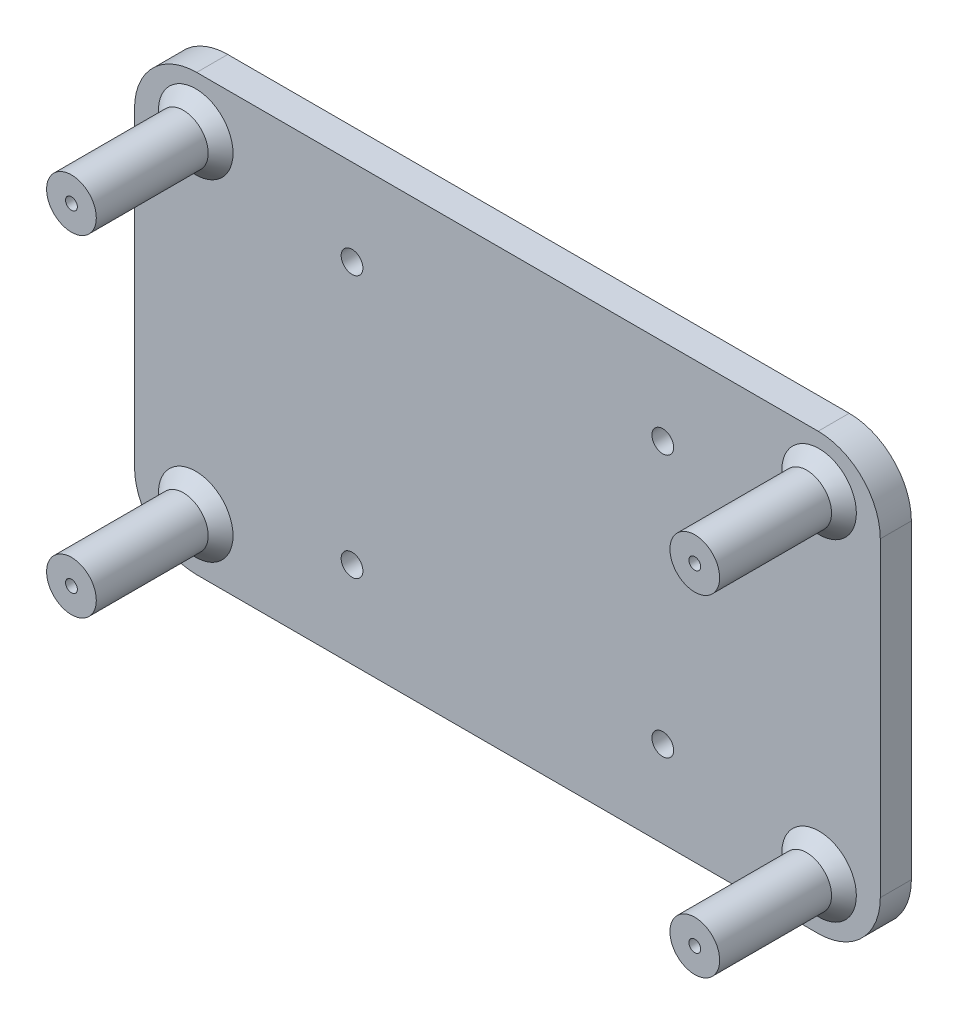
ISO-10303-21;
HEADER;
FILE_DESCRIPTION(('STEP AP214'),'2;1');
FILE_NAME('part.step','',(''),(''),'','','');
FILE_SCHEMA(('AUTOMOTIVE_DESIGN { 1 0 10303 214 1 1 1 1 }'));
ENDSEC;
DATA;
#1=APPLICATION_CONTEXT('core data for automotive mechanical design processes');
#2=APPLICATION_PROTOCOL_DEFINITION('international standard','automotive_design',2000,#1);
#3=PRODUCT_CONTEXT('',#1,'mechanical');
#4=PRODUCT('Part','Part','',(#3));
#5=PRODUCT_RELATED_PRODUCT_CATEGORY('part','',(#4));
#6=PRODUCT_DEFINITION_FORMATION('','',#4);
#7=PRODUCT_DEFINITION_CONTEXT('part definition',#1,'design');
#8=PRODUCT_DEFINITION('design','',#6,#7);
#9=PRODUCT_DEFINITION_SHAPE('','',#8);
#10=(LENGTH_UNIT() NAMED_UNIT(*) SI_UNIT(.MILLI.,.METRE.));
#11=(NAMED_UNIT(*) PLANE_ANGLE_UNIT() SI_UNIT($,.RADIAN.));
#12=(NAMED_UNIT(*) SI_UNIT($,.STERADIAN.) SOLID_ANGLE_UNIT());
#13=UNCERTAINTY_MEASURE_WITH_UNIT(LENGTH_MEASURE(1.E-05),#10,'distance_accuracy_value','');
#14=(GEOMETRIC_REPRESENTATION_CONTEXT(3) GLOBAL_UNCERTAINTY_ASSIGNED_CONTEXT((#13)) GLOBAL_UNIT_ASSIGNED_CONTEXT((#10,
#11,#12)) REPRESENTATION_CONTEXT('',''));
#15=CARTESIAN_POINT('',(0.,0.,0.));
#16=DIRECTION('',(0.,0.,1.));
#17=DIRECTION('',(1.,0.,0.));
#18=AXIS2_PLACEMENT_3D('',#15,#16,#17);
#19=CARTESIAN_POINT('',(-60.,-35.,5.));
#20=DIRECTION('',(1.,0.,0.));
#21=DIRECTION('',(0.,0.,-1.));
#22=AXIS2_PLACEMENT_3D('',#19,#20,#21);
#23=PLANE('',#22);
#24=DIRECTION('',(0.,-1.,0.));
#25=VECTOR('',#24,1.);
#26=CARTESIAN_POINT('',(-60.,-35.,5.));
#27=LINE('',#26,#25);
#28=CARTESIAN_POINT('',(-60.,25.,5.));
#29=VERTEX_POINT('',#28);
#30=CARTESIAN_POINT('',(-60.,-25.,5.));
#31=VERTEX_POINT('',#30);
#32=EDGE_CURVE('E132',#29,#31,#27,.T.);
#33=ORIENTED_EDGE('',*,*,#32,.F.);
#34=DIRECTION('',(0.,0.,-1.));
#35=VECTOR('',#34,1.);
#36=CARTESIAN_POINT('',(-60.,25.,5.));
#37=LINE('',#36,#35);
#38=CARTESIAN_POINT('',(-60.,25.,0.));
#39=VERTEX_POINT('',#38);
#40=EDGE_CURVE('E11',#29,#39,#37,.T.);
#41=ORIENTED_EDGE('',*,*,#40,.T.);
#42=DIRECTION('',(0.,-1.,0.));
#43=VECTOR('',#42,1.);
#44=CARTESIAN_POINT('',(-60.,-35.,0.));
#45=LINE('',#44,#43);
#46=CARTESIAN_POINT('',(-60.,-25.,0.));
#47=VERTEX_POINT('',#46);
#48=EDGE_CURVE('E134',#39,#47,#45,.T.);
#49=ORIENTED_EDGE('',*,*,#48,.T.);
#50=DIRECTION('',(0.,0.,-1.));
#51=VECTOR('',#50,1.);
#52=CARTESIAN_POINT('',(-60.,-25.,5.));
#53=LINE('',#52,#51);
#54=EDGE_CURVE('E44',#47,#31,#53,.F.);
#55=ORIENTED_EDGE('',*,*,#54,.T.);
#56=EDGE_LOOP('',(#33,#41,#49,#55));
#57=FACE_BOUND('',#56,.T.);
#58=ADVANCED_FACE('F35',(#57),#23,.F.);
#59=CARTESIAN_POINT('',(60.,-35.,5.));
#60=DIRECTION('',(0.,1.,0.));
#61=DIRECTION('',(-1.,0.,0.));
#62=AXIS2_PLACEMENT_3D('',#59,#60,#61);
#63=PLANE('',#62);
#64=DIRECTION('',(1.,0.,0.));
#65=VECTOR('',#64,1.);
#66=CARTESIAN_POINT('',(60.,-35.,0.));
#67=LINE('',#66,#65);
#68=CARTESIAN_POINT('',(-50.,-35.,0.));
#69=VERTEX_POINT('',#68);
#70=CARTESIAN_POINT('',(50.,-35.,0.));
#71=VERTEX_POINT('',#70);
#72=EDGE_CURVE('E130',#69,#71,#67,.T.);
#73=ORIENTED_EDGE('',*,*,#72,.T.);
#74=DIRECTION('',(0.,0.,-1.));
#75=VECTOR('',#74,1.);
#76=CARTESIAN_POINT('',(50.,-35.,5.));
#77=LINE('',#76,#75);
#78=CARTESIAN_POINT('',(50.,-35.,5.));
#79=VERTEX_POINT('',#78);
#80=EDGE_CURVE('E109',#71,#79,#77,.F.);
#81=ORIENTED_EDGE('',*,*,#80,.T.);
#82=DIRECTION('',(1.,0.,0.));
#83=VECTOR('',#82,1.);
#84=CARTESIAN_POINT('',(60.,-35.,5.));
#85=LINE('',#84,#83);
#86=CARTESIAN_POINT('',(-50.,-35.,5.));
#87=VERTEX_POINT('',#86);
#88=EDGE_CURVE('E228',#87,#79,#85,.T.);
#89=ORIENTED_EDGE('',*,*,#88,.F.);
#90=DIRECTION('',(0.,0.,-1.));
#91=VECTOR('',#90,1.);
#92=CARTESIAN_POINT('',(-50.,-35.,5.));
#93=LINE('',#92,#91);
#94=EDGE_CURVE('E114',#87,#69,#93,.T.);
#95=ORIENTED_EDGE('',*,*,#94,.T.);
#96=EDGE_LOOP('',(#73,#81,#89,#95));
#97=FACE_BOUND('',#96,.T.);
#98=ADVANCED_FACE('F244',(#97),#63,.F.);
#99=CARTESIAN_POINT('',(60.,-35.,5.));
#100=DIRECTION('',(-1.,0.,0.));
#101=DIRECTION('',(0.,0.,1.));
#102=AXIS2_PLACEMENT_3D('',#99,#100,#101);
#103=PLANE('',#102);
#104=DIRECTION('',(0.,1.,0.));
#105=VECTOR('',#104,1.);
#106=CARTESIAN_POINT('',(60.,-35.,5.));
#107=LINE('',#106,#105);
#108=CARTESIAN_POINT('',(60.,-25.,5.));
#109=VERTEX_POINT('',#108);
#110=CARTESIAN_POINT('',(60.,25.,5.));
#111=VERTEX_POINT('',#110);
#112=EDGE_CURVE('E123',#109,#111,#107,.T.);
#113=ORIENTED_EDGE('',*,*,#112,.F.);
#114=DIRECTION('',(0.,0.,-1.));
#115=VECTOR('',#114,1.);
#116=CARTESIAN_POINT('',(60.,-25.,5.));
#117=LINE('',#116,#115);
#118=CARTESIAN_POINT('',(60.,-25.,0.));
#119=VERTEX_POINT('',#118);
#120=EDGE_CURVE('E108',#109,#119,#117,.T.);
#121=ORIENTED_EDGE('',*,*,#120,.T.);
#122=DIRECTION('',(0.,1.,0.));
#123=VECTOR('',#122,1.);
#124=CARTESIAN_POINT('',(60.,-35.,0.));
#125=LINE('',#124,#123);
#126=CARTESIAN_POINT('',(60.,25.,0.));
#127=VERTEX_POINT('',#126);
#128=EDGE_CURVE('E121',#119,#127,#125,.T.);
#129=ORIENTED_EDGE('',*,*,#128,.T.);
#130=DIRECTION('',(0.,0.,-1.));
#131=VECTOR('',#130,1.);
#132=CARTESIAN_POINT('',(60.,25.,5.));
#133=LINE('',#132,#131);
#134=EDGE_CURVE('E125',#127,#111,#133,.F.);
#135=ORIENTED_EDGE('',*,*,#134,.T.);
#136=EDGE_LOOP('',(#113,#121,#129,#135));
#137=FACE_BOUND('',#136,.T.);
#138=ADVANCED_FACE('F120',(#137),#103,.F.);
#139=CARTESIAN_POINT('',(60.,35.,5.));
#140=DIRECTION('',(0.,-1.,0.));
#141=DIRECTION('',(1.,0.,0.));
#142=AXIS2_PLACEMENT_3D('',#139,#140,#141);
#143=PLANE('',#142);
#144=DIRECTION('',(-1.,0.,0.));
#145=VECTOR('',#144,1.);
#146=CARTESIAN_POINT('',(60.,35.,5.));
#147=LINE('',#146,#145);
#148=CARTESIAN_POINT('',(50.,35.,5.));
#149=VERTEX_POINT('',#148);
#150=CARTESIAN_POINT('',(-50.,35.,5.));
#151=VERTEX_POINT('',#150);
#152=EDGE_CURVE('E142',#149,#151,#147,.T.);
#153=ORIENTED_EDGE('',*,*,#152,.F.);
#154=DIRECTION('',(0.,0.,-1.));
#155=VECTOR('',#154,1.);
#156=CARTESIAN_POINT('',(50.,35.,5.));
#157=LINE('',#156,#155);
#158=CARTESIAN_POINT('',(50.,35.,0.));
#159=VERTEX_POINT('',#158);
#160=EDGE_CURVE('E179',#149,#159,#157,.T.);
#161=ORIENTED_EDGE('',*,*,#160,.T.);
#162=DIRECTION('',(-1.,0.,0.));
#163=VECTOR('',#162,1.);
#164=CARTESIAN_POINT('',(60.,35.,0.));
#165=LINE('',#164,#163);
#166=CARTESIAN_POINT('',(-50.,35.,0.));
#167=VERTEX_POINT('',#166);
#168=EDGE_CURVE('E129',#159,#167,#165,.T.);
#169=ORIENTED_EDGE('',*,*,#168,.T.);
#170=DIRECTION('',(0.,0.,-1.));
#171=VECTOR('',#170,1.);
#172=CARTESIAN_POINT('',(-50.,35.,5.));
#173=LINE('',#172,#171);
#174=EDGE_CURVE('E52',#167,#151,#173,.F.);
#175=ORIENTED_EDGE('',*,*,#174,.T.);
#176=EDGE_LOOP('',(#153,#161,#169,#175));
#177=FACE_BOUND('',#176,.T.);
#178=ADVANCED_FACE('F251',(#177),#143,.F.);
#179=CARTESIAN_POINT('',(0.,0.,5.));
#180=DIRECTION('',(0.,0.,1.));
#181=DIRECTION('',(1.,0.,0.));
#182=AXIS2_PLACEMENT_3D('',#179,#180,#181);
#183=PLANE('',#182);
#184=CARTESIAN_POINT('',(-25.,-21.101703565,5.));
#185=DIRECTION('',(0.,0.,1.));
#186=DIRECTION('',(1.,0.,0.));
#187=AXIS2_PLACEMENT_3D('',#184,#185,#186);
#188=CIRCLE('',#187,1.75);
#189=CARTESIAN_POINT('',(-23.25,-21.101703565,5.));
#190=VERTEX_POINT('',#189);
#191=EDGE_CURVE('E403',#190,#190,#188,.T.);
#192=ORIENTED_EDGE('',*,*,#191,.F.);
#193=EDGE_LOOP('',(#192));
#194=FACE_BOUND('',#193,.T.);
#195=CARTESIAN_POINT('',(25.,-21.101703565,5.));
#196=DIRECTION('',(0.,0.,1.));
#197=DIRECTION('',(1.,0.,0.));
#198=AXIS2_PLACEMENT_3D('',#195,#196,#197);
#199=CIRCLE('',#198,1.75);
#200=CARTESIAN_POINT('',(26.75,-21.101703565,5.));
#201=VERTEX_POINT('',#200);
#202=EDGE_CURVE('E398',#201,#201,#199,.T.);
#203=ORIENTED_EDGE('',*,*,#202,.F.);
#204=EDGE_LOOP('',(#203));
#205=FACE_BOUND('',#204,.T.);
#206=CARTESIAN_POINT('',(25.,21.101703565,5.));
#207=DIRECTION('',(0.,0.,1.));
#208=DIRECTION('',(1.,0.,0.));
#209=AXIS2_PLACEMENT_3D('',#206,#207,#208);
#210=CIRCLE('',#209,1.75);
#211=CARTESIAN_POINT('',(26.75,21.101703565,5.));
#212=VERTEX_POINT('',#211);
#213=EDGE_CURVE('E391',#212,#212,#210,.T.);
#214=ORIENTED_EDGE('',*,*,#213,.F.);
#215=EDGE_LOOP('',(#214));
#216=FACE_BOUND('',#215,.T.);
#217=CARTESIAN_POINT('',(-25.,21.101703565,5.));
#218=DIRECTION('',(0.,0.,1.));
#219=DIRECTION('',(1.,0.,0.));
#220=AXIS2_PLACEMENT_3D('',#217,#218,#219);
#221=CIRCLE('',#220,1.75);
#222=CARTESIAN_POINT('',(-23.25,21.101703565,5.));
#223=VERTEX_POINT('',#222);
#224=EDGE_CURVE('E187',#223,#223,#221,.T.);
#225=ORIENTED_EDGE('',*,*,#224,.F.);
#226=EDGE_LOOP('',(#225));
#227=FACE_BOUND('',#226,.T.);
#228=CARTESIAN_POINT('',(50.15,26.65,5.));
#229=DIRECTION('',(0.,0.,1.));
#230=DIRECTION('',(1.,0.,0.));
#231=AXIS2_PLACEMENT_3D('',#228,#229,#230);
#232=CIRCLE('',#231,6.00000000000001);
#233=CARTESIAN_POINT('',(56.15,26.65,5.));
#234=VERTEX_POINT('',#233);
#235=EDGE_CURVE('E151',#234,#234,#232,.F.);
#236=ORIENTED_EDGE('',*,*,#235,.T.);
#237=EDGE_LOOP('',(#236));
#238=FACE_BOUND('',#237,.T.);
#239=CARTESIAN_POINT('',(50.15,-26.65,5.));
#240=DIRECTION('',(0.,0.,1.));
#241=DIRECTION('',(1.,0.,0.));
#242=AXIS2_PLACEMENT_3D('',#239,#240,#241);
#243=CIRCLE('',#242,6.00000000000001);
#244=CARTESIAN_POINT('',(56.15,-26.65,5.));
#245=VERTEX_POINT('',#244);
#246=EDGE_CURVE('E148',#245,#245,#243,.F.);
#247=ORIENTED_EDGE('',*,*,#246,.T.);
#248=EDGE_LOOP('',(#247));
#249=FACE_BOUND('',#248,.T.);
#250=CARTESIAN_POINT('',(-50.15,-26.65,5.));
#251=DIRECTION('',(0.,0.,1.));
#252=DIRECTION('',(1.,0.,0.));
#253=AXIS2_PLACEMENT_3D('',#250,#251,#252);
#254=CIRCLE('',#253,6.00000000000001);
#255=CARTESIAN_POINT('',(-44.15,-26.65,5.));
#256=VERTEX_POINT('',#255);
#257=EDGE_CURVE('E145',#256,#256,#254,.F.);
#258=ORIENTED_EDGE('',*,*,#257,.T.);
#259=EDGE_LOOP('',(#258));
#260=FACE_BOUND('',#259,.T.);
#261=CARTESIAN_POINT('',(-50.15,26.65,5.));
#262=DIRECTION('',(0.,0.,1.));
#263=DIRECTION('',(1.,0.,0.));
#264=AXIS2_PLACEMENT_3D('',#261,#262,#263);
#265=CIRCLE('',#264,6.00000000000001);
#266=CARTESIAN_POINT('',(-44.15,26.65,5.));
#267=VERTEX_POINT('',#266);
#268=EDGE_CURVE('E141',#267,#267,#265,.F.);
#269=ORIENTED_EDGE('',*,*,#268,.T.);
#270=EDGE_LOOP('',(#269));
#271=FACE_BOUND('',#270,.T.);
#272=ORIENTED_EDGE('',*,*,#88,.T.);
#273=CARTESIAN_POINT('',(50.,-25.,5.));
#274=DIRECTION('',(0.,0.,1.));
#275=DIRECTION('',(1.,0.,0.));
#276=AXIS2_PLACEMENT_3D('',#273,#274,#275);
#277=CIRCLE('',#276,10.);
#278=EDGE_CURVE('E176',#79,#109,#277,.T.);
#279=ORIENTED_EDGE('',*,*,#278,.T.);
#280=ORIENTED_EDGE('',*,*,#112,.T.);
#281=CARTESIAN_POINT('',(50.,25.,5.));
#282=DIRECTION('',(0.,0.,1.));
#283=DIRECTION('',(1.,0.,0.));
#284=AXIS2_PLACEMENT_3D('',#281,#282,#283);
#285=CIRCLE('',#284,10.);
#286=EDGE_CURVE('E59',#111,#149,#285,.T.);
#287=ORIENTED_EDGE('',*,*,#286,.T.);
#288=ORIENTED_EDGE('',*,*,#152,.T.);
#289=CARTESIAN_POINT('',(-50.,25.,5.));
#290=DIRECTION('',(0.,0.,1.));
#291=DIRECTION('',(1.,0.,0.));
#292=AXIS2_PLACEMENT_3D('',#289,#290,#291);
#293=CIRCLE('',#292,10.);
#294=EDGE_CURVE('E173',#151,#29,#293,.T.);
#295=ORIENTED_EDGE('',*,*,#294,.T.);
#296=ORIENTED_EDGE('',*,*,#32,.T.);
#297=CARTESIAN_POINT('',(-50.,-25.,5.));
#298=DIRECTION('',(0.,0.,1.));
#299=DIRECTION('',(1.,0.,0.));
#300=AXIS2_PLACEMENT_3D('',#297,#298,#299);
#301=CIRCLE('',#300,10.);
#302=EDGE_CURVE('E171',#31,#87,#301,.T.);
#303=ORIENTED_EDGE('',*,*,#302,.T.);
#304=EDGE_LOOP('',(#272,#279,#280,#287,#288,#295,#296,#303));
#305=FACE_BOUND('',#304,.T.);
#306=ADVANCED_FACE('F242',(#194,#205,#216,#227,#238,#249,#260,#271,#305),#183,.T.);
#307=CARTESIAN_POINT('',(0.,0.,0.));
#308=DIRECTION('',(0.,0.,1.));
#309=DIRECTION('',(1.,0.,0.));
#310=AXIS2_PLACEMENT_3D('',#307,#308,#309);
#311=PLANE('',#310);
#312=CARTESIAN_POINT('',(-25.,-21.101703565,0.));
#313=DIRECTION('',(0.,0.,1.));
#314=DIRECTION('',(1.,0.,0.));
#315=AXIS2_PLACEMENT_3D('',#312,#313,#314);
#316=CIRCLE('',#315,1.75);
#317=CARTESIAN_POINT('',(-23.25,-21.101703565,0.));
#318=VERTEX_POINT('',#317);
#319=EDGE_CURVE('E39',#318,#318,#316,.T.);
#320=ORIENTED_EDGE('',*,*,#319,.T.);
#321=EDGE_LOOP('',(#320));
#322=FACE_BOUND('',#321,.T.);
#323=CARTESIAN_POINT('',(25.,-21.101703565,0.));
#324=DIRECTION('',(0.,0.,1.));
#325=DIRECTION('',(1.,0.,0.));
#326=AXIS2_PLACEMENT_3D('',#323,#324,#325);
#327=CIRCLE('',#326,1.75);
#328=CARTESIAN_POINT('',(26.75,-21.101703565,0.));
#329=VERTEX_POINT('',#328);
#330=EDGE_CURVE('E189',#329,#329,#327,.T.);
#331=ORIENTED_EDGE('',*,*,#330,.T.);
#332=EDGE_LOOP('',(#331));
#333=FACE_BOUND('',#332,.T.);
#334=CARTESIAN_POINT('',(25.,21.101703565,0.));
#335=DIRECTION('',(0.,0.,1.));
#336=DIRECTION('',(1.,0.,0.));
#337=AXIS2_PLACEMENT_3D('',#334,#335,#336);
#338=CIRCLE('',#337,1.75);
#339=CARTESIAN_POINT('',(26.75,21.101703565,0.));
#340=VERTEX_POINT('',#339);
#341=EDGE_CURVE('E186',#340,#340,#338,.T.);
#342=ORIENTED_EDGE('',*,*,#341,.T.);
#343=EDGE_LOOP('',(#342));
#344=FACE_BOUND('',#343,.T.);
#345=CARTESIAN_POINT('',(-25.,21.101703565,0.));
#346=DIRECTION('',(0.,0.,1.));
#347=DIRECTION('',(1.,0.,0.));
#348=AXIS2_PLACEMENT_3D('',#345,#346,#347);
#349=CIRCLE('',#348,1.75);
#350=CARTESIAN_POINT('',(-23.25,21.101703565,0.));
#351=VERTEX_POINT('',#350);
#352=EDGE_CURVE('E183',#351,#351,#349,.T.);
#353=ORIENTED_EDGE('',*,*,#352,.T.);
#354=EDGE_LOOP('',(#353));
#355=FACE_BOUND('',#354,.T.);
#356=ORIENTED_EDGE('',*,*,#128,.F.);
#357=CARTESIAN_POINT('',(50.,-25.,0.));
#358=DIRECTION('',(0.,0.,1.));
#359=DIRECTION('',(1.,0.,0.));
#360=AXIS2_PLACEMENT_3D('',#357,#358,#359);
#361=CIRCLE('',#360,10.);
#362=EDGE_CURVE('E104',#119,#71,#361,.F.);
#363=ORIENTED_EDGE('',*,*,#362,.T.);
#364=ORIENTED_EDGE('',*,*,#72,.F.);
#365=CARTESIAN_POINT('',(-50.,-25.,0.));
#366=DIRECTION('',(0.,0.,1.));
#367=DIRECTION('',(1.,0.,0.));
#368=AXIS2_PLACEMENT_3D('',#365,#366,#367);
#369=CIRCLE('',#368,10.);
#370=EDGE_CURVE('E124',#69,#47,#369,.F.);
#371=ORIENTED_EDGE('',*,*,#370,.T.);
#372=ORIENTED_EDGE('',*,*,#48,.F.);
#373=CARTESIAN_POINT('',(-50.,25.,0.));
#374=DIRECTION('',(0.,0.,1.));
#375=DIRECTION('',(1.,0.,0.));
#376=AXIS2_PLACEMENT_3D('',#373,#374,#375);
#377=CIRCLE('',#376,10.);
#378=EDGE_CURVE('E165',#39,#167,#377,.F.);
#379=ORIENTED_EDGE('',*,*,#378,.T.);
#380=ORIENTED_EDGE('',*,*,#168,.F.);
#381=CARTESIAN_POINT('',(50.,25.,0.));
#382=DIRECTION('',(0.,0.,1.));
#383=DIRECTION('',(1.,0.,0.));
#384=AXIS2_PLACEMENT_3D('',#381,#382,#383);
#385=CIRCLE('',#384,10.);
#386=EDGE_CURVE('E115',#159,#127,#385,.F.);
#387=ORIENTED_EDGE('',*,*,#386,.T.);
#388=EDGE_LOOP('',(#356,#363,#364,#371,#372,#379,#380,#387));
#389=FACE_BOUND('',#388,.T.);
#390=ADVANCED_FACE('F127',(#322,#333,#344,#355,#389),#311,.F.);
#391=CARTESIAN_POINT('',(-50.15,26.65,25.));
#392=DIRECTION('',(0.,0.,-1.));
#393=DIRECTION('',(-1.,0.,0.));
#394=AXIS2_PLACEMENT_3D('',#391,#392,#393);
#395=CYLINDRICAL_SURFACE('',#394,4.00000000000001);
#396=CARTESIAN_POINT('',(-50.15,26.65,7.00000000000003));
#397=DIRECTION('',(0.,0.,1.));
#398=DIRECTION('',(1.,0.,0.));
#399=AXIS2_PLACEMENT_3D('',#396,#397,#398);
#400=CIRCLE('',#399,4.00000000000001);
#401=CARTESIAN_POINT('',(-46.15,26.65,7.00000000000003));
#402=VERTEX_POINT('',#401);
#403=EDGE_CURVE('E160',#402,#402,#400,.T.);
#404=ORIENTED_EDGE('',*,*,#403,.T.);
#405=EDGE_LOOP('',(#404));
#406=FACE_BOUND('',#405,.T.);
#407=CARTESIAN_POINT('',(-50.15,26.65,25.));
#408=DIRECTION('',(0.,0.,1.));
#409=DIRECTION('',(1.,0.,0.));
#410=AXIS2_PLACEMENT_3D('',#407,#408,#409);
#411=CIRCLE('',#410,4.00000000000001);
#412=CARTESIAN_POINT('',(-46.15,26.65,25.));
#413=VERTEX_POINT('',#412);
#414=EDGE_CURVE('E223',#413,#413,#411,.T.);
#415=ORIENTED_EDGE('',*,*,#414,.F.);
#416=EDGE_LOOP('',(#415));
#417=FACE_BOUND('',#416,.T.);
#418=ADVANCED_FACE('F310',(#406,#417),#395,.T.);
#419=CARTESIAN_POINT('',(-50.15,26.65,25.));
#420=DIRECTION('',(0.,0.,1.));
#421=DIRECTION('',(1.,0.,0.));
#422=AXIS2_PLACEMENT_3D('',#419,#420,#421);
#423=PLANE('',#422);
#424=CARTESIAN_POINT('',(-50.15,26.65,25.));
#425=DIRECTION('',(0.,0.,1.));
#426=DIRECTION('',(1.,0.,0.));
#427=AXIS2_PLACEMENT_3D('',#424,#425,#426);
#428=CIRCLE('',#427,0.950000000000001);
#429=CARTESIAN_POINT('',(-49.2,26.65,25.));
#430=VERTEX_POINT('',#429);
#431=EDGE_CURVE('E211',#430,#430,#428,.T.);
#432=ORIENTED_EDGE('',*,*,#431,.F.);
#433=EDGE_LOOP('',(#432));
#434=FACE_BOUND('',#433,.T.);
#435=ORIENTED_EDGE('',*,*,#414,.T.);
#436=EDGE_LOOP('',(#435));
#437=FACE_BOUND('',#436,.T.);
#438=ADVANCED_FACE('F314',(#434,#437),#423,.T.);
#439=CARTESIAN_POINT('',(50.15,-26.65,25.));
#440=DIRECTION('',(0.,0.,-1.));
#441=DIRECTION('',(-1.,0.,0.));
#442=AXIS2_PLACEMENT_3D('',#439,#440,#441);
#443=CYLINDRICAL_SURFACE('',#442,4.00000000000001);
#444=CARTESIAN_POINT('',(50.15,-26.65,7.00000000000003));
#445=DIRECTION('',(0.,0.,1.));
#446=DIRECTION('',(1.,0.,0.));
#447=AXIS2_PLACEMENT_3D('',#444,#445,#446);
#448=CIRCLE('',#447,4.00000000000001);
#449=CARTESIAN_POINT('',(54.15,-26.65,7.00000000000003));
#450=VERTEX_POINT('',#449);
#451=EDGE_CURVE('E154',#450,#450,#448,.T.);
#452=ORIENTED_EDGE('',*,*,#451,.T.);
#453=EDGE_LOOP('',(#452));
#454=FACE_BOUND('',#453,.T.);
#455=CARTESIAN_POINT('',(50.15,-26.65,25.));
#456=DIRECTION('',(0.,0.,1.));
#457=DIRECTION('',(1.,0.,0.));
#458=AXIS2_PLACEMENT_3D('',#455,#456,#457);
#459=CIRCLE('',#458,4.00000000000001);
#460=CARTESIAN_POINT('',(54.15,-26.65,25.));
#461=VERTEX_POINT('',#460);
#462=EDGE_CURVE('E220',#461,#461,#459,.T.);
#463=ORIENTED_EDGE('',*,*,#462,.F.);
#464=EDGE_LOOP('',(#463));
#465=FACE_BOUND('',#464,.T.);
#466=ADVANCED_FACE('F318',(#454,#465),#443,.T.);
#467=CARTESIAN_POINT('',(50.15,-26.65,25.));
#468=DIRECTION('',(0.,0.,1.));
#469=DIRECTION('',(1.,0.,0.));
#470=AXIS2_PLACEMENT_3D('',#467,#468,#469);
#471=PLANE('',#470);
#472=CARTESIAN_POINT('',(50.15,-26.65,25.));
#473=DIRECTION('',(0.,0.,1.));
#474=DIRECTION('',(1.,0.,0.));
#475=AXIS2_PLACEMENT_3D('',#472,#473,#474);
#476=CIRCLE('',#475,0.950000000000001);
#477=CARTESIAN_POINT('',(51.1,-26.65,25.));
#478=VERTEX_POINT('',#477);
#479=EDGE_CURVE('E203',#478,#478,#476,.T.);
#480=ORIENTED_EDGE('',*,*,#479,.F.);
#481=EDGE_LOOP('',(#480));
#482=FACE_BOUND('',#481,.T.);
#483=ORIENTED_EDGE('',*,*,#462,.T.);
#484=EDGE_LOOP('',(#483));
#485=FACE_BOUND('',#484,.T.);
#486=ADVANCED_FACE('F322',(#482,#485),#471,.T.);
#487=CARTESIAN_POINT('',(50.15,26.65,25.));
#488=DIRECTION('',(0.,0.,-1.));
#489=DIRECTION('',(-1.,0.,0.));
#490=AXIS2_PLACEMENT_3D('',#487,#488,#489);
#491=CYLINDRICAL_SURFACE('',#490,4.00000000000001);
#492=CARTESIAN_POINT('',(50.15,26.65,7.00000000000003));
#493=DIRECTION('',(0.,0.,1.));
#494=DIRECTION('',(1.,0.,0.));
#495=AXIS2_PLACEMENT_3D('',#492,#493,#494);
#496=CIRCLE('',#495,4.00000000000001);
#497=CARTESIAN_POINT('',(54.15,26.65,7.00000000000003));
#498=VERTEX_POINT('',#497);
#499=EDGE_CURVE('E138',#498,#498,#496,.T.);
#500=ORIENTED_EDGE('',*,*,#499,.T.);
#501=EDGE_LOOP('',(#500));
#502=FACE_BOUND('',#501,.T.);
#503=CARTESIAN_POINT('',(50.15,26.65,25.));
#504=DIRECTION('',(0.,0.,1.));
#505=DIRECTION('',(1.,0.,0.));
#506=AXIS2_PLACEMENT_3D('',#503,#504,#505);
#507=CIRCLE('',#506,4.00000000000001);
#508=CARTESIAN_POINT('',(54.15,26.65,25.));
#509=VERTEX_POINT('',#508);
#510=EDGE_CURVE('E217',#509,#509,#507,.T.);
#511=ORIENTED_EDGE('',*,*,#510,.F.);
#512=EDGE_LOOP('',(#511));
#513=FACE_BOUND('',#512,.T.);
#514=ADVANCED_FACE('F326',(#502,#513),#491,.T.);
#515=CARTESIAN_POINT('',(50.15,26.65,25.));
#516=DIRECTION('',(0.,0.,1.));
#517=DIRECTION('',(1.,0.,0.));
#518=AXIS2_PLACEMENT_3D('',#515,#516,#517);
#519=PLANE('',#518);
#520=CARTESIAN_POINT('',(50.15,26.65,25.));
#521=DIRECTION('',(0.,0.,1.));
#522=DIRECTION('',(1.,0.,0.));
#523=AXIS2_PLACEMENT_3D('',#520,#521,#522);
#524=CIRCLE('',#523,0.950000000000001);
#525=CARTESIAN_POINT('',(51.1,26.65,25.));
#526=VERTEX_POINT('',#525);
#527=EDGE_CURVE('E410',#526,#526,#524,.T.);
#528=ORIENTED_EDGE('',*,*,#527,.F.);
#529=EDGE_LOOP('',(#528));
#530=FACE_BOUND('',#529,.T.);
#531=ORIENTED_EDGE('',*,*,#510,.T.);
#532=EDGE_LOOP('',(#531));
#533=FACE_BOUND('',#532,.T.);
#534=ADVANCED_FACE('F330',(#530,#533),#519,.T.);
#535=CARTESIAN_POINT('',(-50.15,-26.65,25.));
#536=DIRECTION('',(0.,0.,-1.));
#537=DIRECTION('',(-1.,0.,0.));
#538=AXIS2_PLACEMENT_3D('',#535,#536,#537);
#539=CYLINDRICAL_SURFACE('',#538,4.00000000000001);
#540=CARTESIAN_POINT('',(-50.15,-26.65,7.00000000000003));
#541=DIRECTION('',(0.,0.,1.));
#542=DIRECTION('',(1.,0.,0.));
#543=AXIS2_PLACEMENT_3D('',#540,#541,#542);
#544=CIRCLE('',#543,4.00000000000001);
#545=CARTESIAN_POINT('',(-46.15,-26.65,7.00000000000003));
#546=VERTEX_POINT('',#545);
#547=EDGE_CURVE('E157',#546,#546,#544,.T.);
#548=ORIENTED_EDGE('',*,*,#547,.T.);
#549=EDGE_LOOP('',(#548));
#550=FACE_BOUND('',#549,.T.);
#551=CARTESIAN_POINT('',(-50.15,-26.65,25.));
#552=DIRECTION('',(0.,0.,1.));
#553=DIRECTION('',(1.,0.,0.));
#554=AXIS2_PLACEMENT_3D('',#551,#552,#553);
#555=CIRCLE('',#554,4.00000000000001);
#556=CARTESIAN_POINT('',(-46.15,-26.65,25.));
#557=VERTEX_POINT('',#556);
#558=EDGE_CURVE('E210',#557,#557,#555,.T.);
#559=ORIENTED_EDGE('',*,*,#558,.F.);
#560=EDGE_LOOP('',(#559));
#561=FACE_BOUND('',#560,.T.);
#562=ADVANCED_FACE('F334',(#550,#561),#539,.T.);
#563=CARTESIAN_POINT('',(-50.15,-26.65,25.));
#564=DIRECTION('',(0.,0.,1.));
#565=DIRECTION('',(1.,0.,0.));
#566=AXIS2_PLACEMENT_3D('',#563,#564,#565);
#567=PLANE('',#566);
#568=CARTESIAN_POINT('',(-50.15,-26.65,25.));
#569=DIRECTION('',(0.,0.,1.));
#570=DIRECTION('',(1.,0.,0.));
#571=AXIS2_PLACEMENT_3D('',#568,#569,#570);
#572=CIRCLE('',#571,0.950000000000001);
#573=CARTESIAN_POINT('',(-49.2,-26.65,25.));
#574=VERTEX_POINT('',#573);
#575=EDGE_CURVE('E194',#574,#574,#572,.T.);
#576=ORIENTED_EDGE('',*,*,#575,.F.);
#577=EDGE_LOOP('',(#576));
#578=FACE_BOUND('',#577,.T.);
#579=ORIENTED_EDGE('',*,*,#558,.T.);
#580=EDGE_LOOP('',(#579));
#581=FACE_BOUND('',#580,.T.);
#582=ADVANCED_FACE('F264',(#578,#581),#567,.T.);
#583=CARTESIAN_POINT('',(50.15,26.65,7.00000000000003));
#584=DIRECTION('',(0.,0.,-1.));
#585=DIRECTION('',(-1.,0.,0.));
#586=AXIS2_PLACEMENT_3D('',#583,#584,#585);
#587=CONICAL_SURFACE('',#586,4.00000000000001,0.785398163397442);
#588=ORIENTED_EDGE('',*,*,#235,.F.);
#589=EDGE_LOOP('',(#588));
#590=FACE_BOUND('',#589,.T.);
#591=ORIENTED_EDGE('',*,*,#499,.F.);
#592=EDGE_LOOP('',(#591));
#593=FACE_BOUND('',#592,.T.);
#594=ADVANCED_FACE('F257',(#590,#593),#587,.T.);
#595=CARTESIAN_POINT('',(50.15,-26.65,7.00000000000003));
#596=DIRECTION('',(0.,0.,-1.));
#597=DIRECTION('',(-1.,0.,0.));
#598=AXIS2_PLACEMENT_3D('',#595,#596,#597);
#599=CONICAL_SURFACE('',#598,4.00000000000001,0.785398163397442);
#600=ORIENTED_EDGE('',*,*,#246,.F.);
#601=EDGE_LOOP('',(#600));
#602=FACE_BOUND('',#601,.T.);
#603=ORIENTED_EDGE('',*,*,#451,.F.);
#604=EDGE_LOOP('',(#603));
#605=FACE_BOUND('',#604,.T.);
#606=ADVANCED_FACE('F263',(#602,#605),#599,.T.);
#607=CARTESIAN_POINT('',(-50.15,-26.65,7.00000000000003));
#608=DIRECTION('',(0.,0.,-1.));
#609=DIRECTION('',(-1.,0.,0.));
#610=AXIS2_PLACEMENT_3D('',#607,#608,#609);
#611=CONICAL_SURFACE('',#610,4.00000000000001,0.785398163397442);
#612=ORIENTED_EDGE('',*,*,#257,.F.);
#613=EDGE_LOOP('',(#612));
#614=FACE_BOUND('',#613,.T.);
#615=ORIENTED_EDGE('',*,*,#547,.F.);
#616=EDGE_LOOP('',(#615));
#617=FACE_BOUND('',#616,.T.);
#618=ADVANCED_FACE('F271',(#614,#617),#611,.T.);
#619=CARTESIAN_POINT('',(-50.15,26.65,7.00000000000003));
#620=DIRECTION('',(0.,0.,-1.));
#621=DIRECTION('',(-1.,0.,0.));
#622=AXIS2_PLACEMENT_3D('',#619,#620,#621);
#623=CONICAL_SURFACE('',#622,4.00000000000001,0.785398163397442);
#624=ORIENTED_EDGE('',*,*,#268,.F.);
#625=EDGE_LOOP('',(#624));
#626=FACE_BOUND('',#625,.T.);
#627=ORIENTED_EDGE('',*,*,#403,.F.);
#628=EDGE_LOOP('',(#627));
#629=FACE_BOUND('',#628,.T.);
#630=ADVANCED_FACE('F278',(#626,#629),#623,.T.);
#631=CARTESIAN_POINT('',(-50.15,-26.65,10.));
#632=DIRECTION('',(0.,0.,1.));
#633=DIRECTION('',(1.,0.,0.));
#634=AXIS2_PLACEMENT_3D('',#631,#632,#633);
#635=CYLINDRICAL_SURFACE('',#634,0.950000000000001);
#636=CARTESIAN_POINT('',(-50.15,-26.65,10.));
#637=DIRECTION('',(0.,0.,1.));
#638=DIRECTION('',(1.,0.,0.));
#639=AXIS2_PLACEMENT_3D('',#636,#637,#638);
#640=CIRCLE('',#639,0.950000000000001);
#641=CARTESIAN_POINT('',(-49.2,-26.65,10.));
#642=VERTEX_POINT('',#641);
#643=EDGE_CURVE('E198',#642,#642,#640,.T.);
#644=ORIENTED_EDGE('',*,*,#643,.F.);
#645=EDGE_LOOP('',(#644));
#646=FACE_BOUND('',#645,.T.);
#647=ORIENTED_EDGE('',*,*,#575,.T.);
#648=EDGE_LOOP('',(#647));
#649=FACE_BOUND('',#648,.T.);
#650=ADVANCED_FACE('F284',(#646,#649),#635,.F.);
#651=CARTESIAN_POINT('',(-50.15,-26.65,10.));
#652=DIRECTION('',(0.,0.,1.));
#653=DIRECTION('',(1.,0.,0.));
#654=AXIS2_PLACEMENT_3D('',#651,#652,#653);
#655=PLANE('',#654);
#656=ORIENTED_EDGE('',*,*,#643,.T.);
#657=EDGE_LOOP('',(#656));
#658=FACE_BOUND('',#657,.T.);
#659=ADVANCED_FACE('F352',(#658),#655,.T.);
#660=CARTESIAN_POINT('',(50.15,26.65,10.));
#661=DIRECTION('',(0.,0.,1.));
#662=DIRECTION('',(1.,0.,0.));
#663=AXIS2_PLACEMENT_3D('',#660,#661,#662);
#664=CYLINDRICAL_SURFACE('',#663,0.950000000000001);
#665=CARTESIAN_POINT('',(50.15,26.65,10.));
#666=DIRECTION('',(0.,0.,1.));
#667=DIRECTION('',(1.,0.,0.));
#668=AXIS2_PLACEMENT_3D('',#665,#666,#667);
#669=CIRCLE('',#668,0.950000000000001);
#670=CARTESIAN_POINT('',(51.1,26.65,10.));
#671=VERTEX_POINT('',#670);
#672=EDGE_CURVE('E214',#671,#671,#669,.T.);
#673=ORIENTED_EDGE('',*,*,#672,.F.);
#674=EDGE_LOOP('',(#673));
#675=FACE_BOUND('',#674,.T.);
#676=ORIENTED_EDGE('',*,*,#527,.T.);
#677=EDGE_LOOP('',(#676));
#678=FACE_BOUND('',#677,.T.);
#679=ADVANCED_FACE('F356',(#675,#678),#664,.F.);
#680=CARTESIAN_POINT('',(50.15,26.65,10.));
#681=DIRECTION('',(0.,0.,1.));
#682=DIRECTION('',(1.,0.,0.));
#683=AXIS2_PLACEMENT_3D('',#680,#681,#682);
#684=PLANE('',#683);
#685=ORIENTED_EDGE('',*,*,#672,.T.);
#686=EDGE_LOOP('',(#685));
#687=FACE_BOUND('',#686,.T.);
#688=ADVANCED_FACE('F361',(#687),#684,.T.);
#689=CARTESIAN_POINT('',(50.15,-26.65,10.));
#690=DIRECTION('',(0.,0.,1.));
#691=DIRECTION('',(1.,0.,0.));
#692=AXIS2_PLACEMENT_3D('',#689,#690,#691);
#693=CYLINDRICAL_SURFACE('',#692,0.950000000000001);
#694=CARTESIAN_POINT('',(50.15,-26.65,10.));
#695=DIRECTION('',(0.,0.,1.));
#696=DIRECTION('',(1.,0.,0.));
#697=AXIS2_PLACEMENT_3D('',#694,#695,#696);
#698=CIRCLE('',#697,0.950000000000001);
#699=CARTESIAN_POINT('',(51.1,-26.65,10.));
#700=VERTEX_POINT('',#699);
#701=EDGE_CURVE('E413',#700,#700,#698,.T.);
#702=ORIENTED_EDGE('',*,*,#701,.F.);
#703=EDGE_LOOP('',(#702));
#704=FACE_BOUND('',#703,.T.);
#705=ORIENTED_EDGE('',*,*,#479,.T.);
#706=EDGE_LOOP('',(#705));
#707=FACE_BOUND('',#706,.T.);
#708=ADVANCED_FACE('F358',(#704,#707),#693,.F.);
#709=CARTESIAN_POINT('',(50.15,-26.65,10.));
#710=DIRECTION('',(0.,0.,1.));
#711=DIRECTION('',(1.,0.,0.));
#712=AXIS2_PLACEMENT_3D('',#709,#710,#711);
#713=PLANE('',#712);
#714=ORIENTED_EDGE('',*,*,#701,.T.);
#715=EDGE_LOOP('',(#714));
#716=FACE_BOUND('',#715,.T.);
#717=ADVANCED_FACE('F345',(#716),#713,.T.);
#718=CARTESIAN_POINT('',(-50.15,26.65,10.));
#719=DIRECTION('',(0.,0.,1.));
#720=DIRECTION('',(1.,0.,0.));
#721=AXIS2_PLACEMENT_3D('',#718,#719,#720);
#722=CYLINDRICAL_SURFACE('',#721,0.950000000000001);
#723=CARTESIAN_POINT('',(-50.15,26.65,10.));
#724=DIRECTION('',(0.,0.,1.));
#725=DIRECTION('',(1.,0.,0.));
#726=AXIS2_PLACEMENT_3D('',#723,#724,#725);
#727=CIRCLE('',#726,0.950000000000001);
#728=CARTESIAN_POINT('',(-49.2,26.65,10.));
#729=VERTEX_POINT('',#728);
#730=EDGE_CURVE('E207',#729,#729,#727,.T.);
#731=ORIENTED_EDGE('',*,*,#730,.F.);
#732=EDGE_LOOP('',(#731));
#733=FACE_BOUND('',#732,.T.);
#734=ORIENTED_EDGE('',*,*,#431,.T.);
#735=EDGE_LOOP('',(#734));
#736=FACE_BOUND('',#735,.T.);
#737=ADVANCED_FACE('F342',(#733,#736),#722,.F.);
#738=CARTESIAN_POINT('',(-50.15,26.65,10.));
#739=DIRECTION('',(0.,0.,1.));
#740=DIRECTION('',(1.,0.,0.));
#741=AXIS2_PLACEMENT_3D('',#738,#739,#740);
#742=PLANE('',#741);
#743=ORIENTED_EDGE('',*,*,#730,.T.);
#744=EDGE_LOOP('',(#743));
#745=FACE_BOUND('',#744,.T.);
#746=ADVANCED_FACE('F289',(#745),#742,.T.);
#747=CARTESIAN_POINT('',(50.,-25.,5.));
#748=DIRECTION('',(0.,0.,-1.));
#749=DIRECTION('',(-1.,0.,0.));
#750=AXIS2_PLACEMENT_3D('',#747,#748,#749);
#751=CYLINDRICAL_SURFACE('',#750,10.);
#752=ORIENTED_EDGE('',*,*,#278,.F.);
#753=ORIENTED_EDGE('',*,*,#80,.F.);
#754=ORIENTED_EDGE('',*,*,#362,.F.);
#755=ORIENTED_EDGE('',*,*,#120,.F.);
#756=EDGE_LOOP('',(#752,#753,#754,#755));
#757=FACE_BOUND('',#756,.T.);
#758=ADVANCED_FACE('F107',(#757),#751,.T.);
#759=CARTESIAN_POINT('',(50.,25.,5.));
#760=DIRECTION('',(0.,0.,-1.));
#761=DIRECTION('',(-1.,0.,0.));
#762=AXIS2_PLACEMENT_3D('',#759,#760,#761);
#763=CYLINDRICAL_SURFACE('',#762,10.);
#764=ORIENTED_EDGE('',*,*,#286,.F.);
#765=ORIENTED_EDGE('',*,*,#134,.F.);
#766=ORIENTED_EDGE('',*,*,#386,.F.);
#767=ORIENTED_EDGE('',*,*,#160,.F.);
#768=EDGE_LOOP('',(#764,#765,#766,#767));
#769=FACE_BOUND('',#768,.T.);
#770=ADVANCED_FACE('F288',(#769),#763,.T.);
#771=CARTESIAN_POINT('',(-50.,25.,5.));
#772=DIRECTION('',(0.,0.,-1.));
#773=DIRECTION('',(-1.,0.,0.));
#774=AXIS2_PLACEMENT_3D('',#771,#772,#773);
#775=CYLINDRICAL_SURFACE('',#774,10.);
#776=ORIENTED_EDGE('',*,*,#294,.F.);
#777=ORIENTED_EDGE('',*,*,#174,.F.);
#778=ORIENTED_EDGE('',*,*,#378,.F.);
#779=ORIENTED_EDGE('',*,*,#40,.F.);
#780=EDGE_LOOP('',(#776,#777,#778,#779));
#781=FACE_BOUND('',#780,.T.);
#782=ADVANCED_FACE('F291',(#781),#775,.T.);
#783=CARTESIAN_POINT('',(-50.,-25.,5.));
#784=DIRECTION('',(0.,0.,-1.));
#785=DIRECTION('',(-1.,0.,0.));
#786=AXIS2_PLACEMENT_3D('',#783,#784,#785);
#787=CYLINDRICAL_SURFACE('',#786,10.);
#788=ORIENTED_EDGE('',*,*,#302,.F.);
#789=ORIENTED_EDGE('',*,*,#54,.F.);
#790=ORIENTED_EDGE('',*,*,#370,.F.);
#791=ORIENTED_EDGE('',*,*,#94,.F.);
#792=EDGE_LOOP('',(#788,#789,#790,#791));
#793=FACE_BOUND('',#792,.T.);
#794=ADVANCED_FACE('F37',(#793),#787,.T.);
#795=CARTESIAN_POINT('',(-25.,21.101703565,-5.));
#796=DIRECTION('',(0.,0.,1.));
#797=DIRECTION('',(1.,0.,0.));
#798=AXIS2_PLACEMENT_3D('',#795,#796,#797);
#799=CYLINDRICAL_SURFACE('',#798,1.75);
#800=ORIENTED_EDGE('',*,*,#224,.T.);
#801=EDGE_LOOP('',(#800));
#802=FACE_BOUND('',#801,.T.);
#803=ORIENTED_EDGE('',*,*,#352,.F.);
#804=EDGE_LOOP('',(#803));
#805=FACE_BOUND('',#804,.T.);
#806=ADVANCED_FACE('F298',(#802,#805),#799,.F.);
#807=CARTESIAN_POINT('',(25.,21.101703565,-5.));
#808=DIRECTION('',(0.,0.,1.));
#809=DIRECTION('',(1.,0.,0.));
#810=AXIS2_PLACEMENT_3D('',#807,#808,#809);
#811=CYLINDRICAL_SURFACE('',#810,1.75);
#812=ORIENTED_EDGE('',*,*,#213,.T.);
#813=EDGE_LOOP('',(#812));
#814=FACE_BOUND('',#813,.T.);
#815=ORIENTED_EDGE('',*,*,#341,.F.);
#816=EDGE_LOOP('',(#815));
#817=FACE_BOUND('',#816,.T.);
#818=ADVANCED_FACE('F374',(#814,#817),#811,.F.);
#819=CARTESIAN_POINT('',(25.,-21.101703565,-5.));
#820=DIRECTION('',(0.,0.,1.));
#821=DIRECTION('',(1.,0.,0.));
#822=AXIS2_PLACEMENT_3D('',#819,#820,#821);
#823=CYLINDRICAL_SURFACE('',#822,1.75);
#824=ORIENTED_EDGE('',*,*,#202,.T.);
#825=EDGE_LOOP('',(#824));
#826=FACE_BOUND('',#825,.T.);
#827=ORIENTED_EDGE('',*,*,#330,.F.);
#828=EDGE_LOOP('',(#827));
#829=FACE_BOUND('',#828,.T.);
#830=ADVANCED_FACE('F379',(#826,#829),#823,.F.);
#831=CARTESIAN_POINT('',(-25.,-21.101703565,-5.));
#832=DIRECTION('',(0.,0.,1.));
#833=DIRECTION('',(1.,0.,0.));
#834=AXIS2_PLACEMENT_3D('',#831,#832,#833);
#835=CYLINDRICAL_SURFACE('',#834,1.75);
#836=ORIENTED_EDGE('',*,*,#191,.T.);
#837=EDGE_LOOP('',(#836));
#838=FACE_BOUND('',#837,.T.);
#839=ORIENTED_EDGE('',*,*,#319,.F.);
#840=EDGE_LOOP('',(#839));
#841=FACE_BOUND('',#840,.T.);
#842=ADVANCED_FACE('F376',(#838,#841),#835,.F.);
#843=CLOSED_SHELL('',(#58,#98,#138,#178,#306,#390,#418,#438,#466,#486,#514,#534,#562,#582,#594,
#606,#618,#630,#650,#659,#679,#688,#708,#717,#737,#746,#758,#770,#782,#794,#806,#818,#830,#842));
#844=MANIFOLD_SOLID_BREP('B2',#843);
#845=ADVANCED_BREP_SHAPE_REPRESENTATION('',(#18,#844),#14);
#846=SHAPE_DEFINITION_REPRESENTATION(#9,#845);
ENDSEC;
END-ISO-10303-21;
